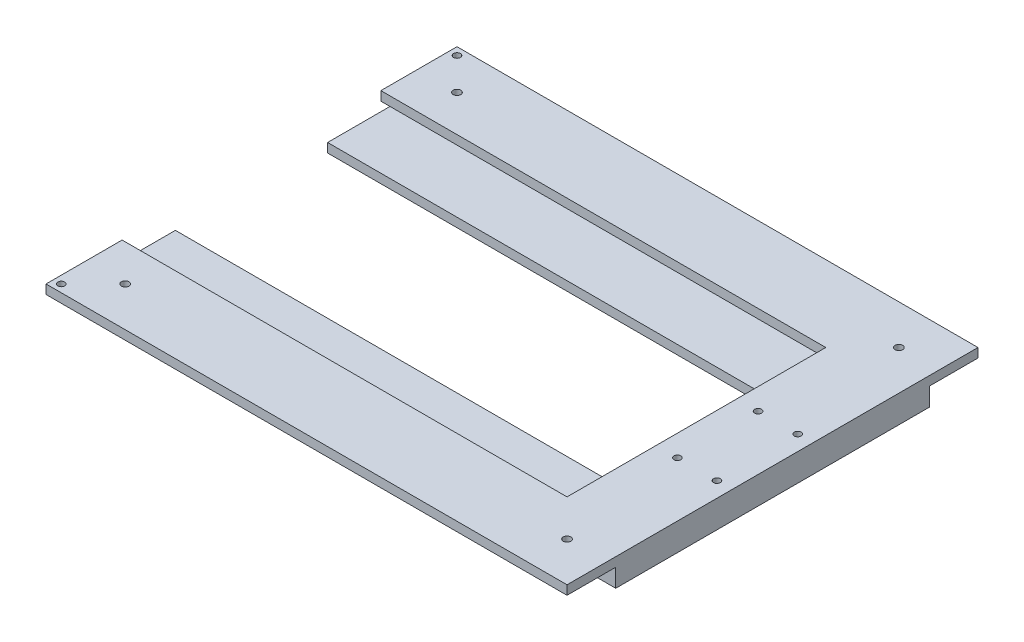
ISO-10303-21;
HEADER;
FILE_DESCRIPTION(('STEP AP214'),'2;1');
FILE_NAME('part.step','',(''),(''),'','','');
FILE_SCHEMA(('AUTOMOTIVE_DESIGN { 1 0 10303 214 1 1 1 1 }'));
ENDSEC;
DATA;
#1=APPLICATION_CONTEXT('core data for automotive mechanical design processes');
#2=APPLICATION_PROTOCOL_DEFINITION('international standard','automotive_design',2000,#1);
#3=PRODUCT_CONTEXT('',#1,'mechanical');
#4=PRODUCT('Part','Part','',(#3));
#5=PRODUCT_RELATED_PRODUCT_CATEGORY('part','',(#4));
#6=PRODUCT_DEFINITION_FORMATION('','',#4);
#7=PRODUCT_DEFINITION_CONTEXT('part definition',#1,'design');
#8=PRODUCT_DEFINITION('design','',#6,#7);
#9=PRODUCT_DEFINITION_SHAPE('','',#8);
#10=(LENGTH_UNIT() NAMED_UNIT(*) SI_UNIT(.MILLI.,.METRE.));
#11=(NAMED_UNIT(*) PLANE_ANGLE_UNIT() SI_UNIT($,.RADIAN.));
#12=(NAMED_UNIT(*) SI_UNIT($,.STERADIAN.) SOLID_ANGLE_UNIT());
#13=UNCERTAINTY_MEASURE_WITH_UNIT(LENGTH_MEASURE(1.E-05),#10,'distance_accuracy_value','');
#14=(GEOMETRIC_REPRESENTATION_CONTEXT(3) GLOBAL_UNCERTAINTY_ASSIGNED_CONTEXT((#13)) GLOBAL_UNIT_ASSIGNED_CONTEXT((#10,
#11,#12)) REPRESENTATION_CONTEXT('',''));
#15=CARTESIAN_POINT('',(0.,0.,0.));
#16=DIRECTION('',(0.,0.,1.));
#17=DIRECTION('',(1.,0.,0.));
#18=AXIS2_PLACEMENT_3D('',#15,#16,#17);
#19=CARTESIAN_POINT('',(0.,0.,0.));
#20=DIRECTION('',(0.,1.,0.));
#21=DIRECTION('',(0.,0.,1.));
#22=AXIS2_PLACEMENT_3D('',#19,#20,#21);
#23=PLANE('',#22);
#24=CARTESIAN_POINT('',(-287.3,0.,342.921508101416));
#25=DIRECTION('',(0.,-1.,0.));
#26=DIRECTION('',(0.,0.,-1.));
#27=AXIS2_PLACEMENT_3D('',#24,#25,#26);
#28=CIRCLE('',#27,2.24999999999996);
#29=CARTESIAN_POINT('',(-287.3,0.,340.671508101416));
#30=VERTEX_POINT('',#29);
#31=EDGE_CURVE('E583',#30,#30,#28,.T.);
#32=ORIENTED_EDGE('',*,*,#31,.F.);
#33=EDGE_LOOP('',(#32));
#34=FACE_BOUND('',#33,.T.);
#35=CARTESIAN_POINT('',(-266.3,0.,321.921508101416));
#36=DIRECTION('',(0.,1.,0.));
#37=DIRECTION('',(0.,0.,1.));
#38=AXIS2_PLACEMENT_3D('',#35,#36,#37);
#39=CIRCLE('',#38,2.49999999999991);
#40=CARTESIAN_POINT('',(-266.3,0.,324.421508101416));
#41=VERTEX_POINT('',#40);
#42=EDGE_CURVE('E288',#41,#41,#39,.T.);
#43=ORIENTED_EDGE('',*,*,#42,.T.);
#44=EDGE_LOOP('',(#43));
#45=FACE_BOUND('',#44,.T.);
#46=CARTESIAN_POINT('',(23.9999999999999,0.,321.921508101416));
#47=DIRECTION('',(0.,1.,0.));
#48=DIRECTION('',(0.,0.,1.));
#49=AXIS2_PLACEMENT_3D('',#46,#47,#48);
#50=CIRCLE('',#49,2.49999999999991);
#51=CARTESIAN_POINT('',(23.9999999999999,0.,324.421508101416));
#52=VERTEX_POINT('',#51);
#53=EDGE_CURVE('E277',#52,#52,#50,.T.);
#54=ORIENTED_EDGE('',*,*,#53,.T.);
#55=EDGE_LOOP('',(#54));
#56=FACE_BOUND('',#55,.T.);
#57=DIRECTION('',(-1.,0.,0.));
#58=VECTOR('',#57,1.);
#59=CARTESIAN_POINT('',(49.9999999999999,0.,315.921508101416));
#60=LINE('',#59,#58);
#61=CARTESIAN_POINT('',(49.9999999999999,0.,315.921508101416));
#62=VERTEX_POINT('',#61);
#63=CARTESIAN_POINT('',(-292.3,0.,315.921508101416));
#64=VERTEX_POINT('',#63);
#65=EDGE_CURVE('E300',#62,#64,#60,.T.);
#66=ORIENTED_EDGE('',*,*,#65,.F.);
#67=DIRECTION('',(0.,0.,-1.));
#68=VECTOR('',#67,1.);
#69=CARTESIAN_POINT('',(49.9999999999999,0.,77.9215081014159));
#70=LINE('',#69,#68);
#71=CARTESIAN_POINT('',(49.9999999999999,0.,347.921508101416));
#72=VERTEX_POINT('',#71);
#73=EDGE_CURVE('E409',#72,#62,#70,.T.);
#74=ORIENTED_EDGE('',*,*,#73,.F.);
#75=DIRECTION('',(1.,0.,0.));
#76=VECTOR('',#75,1.);
#77=CARTESIAN_POINT('',(-292.3,0.,347.921508101416));
#78=LINE('',#77,#76);
#79=CARTESIAN_POINT('',(-292.3,0.,347.921508101416));
#80=VERTEX_POINT('',#79);
#81=EDGE_CURVE('E405',#80,#72,#78,.T.);
#82=ORIENTED_EDGE('',*,*,#81,.F.);
#83=DIRECTION('',(0.,0.,1.));
#84=VECTOR('',#83,1.);
#85=CARTESIAN_POINT('',(-292.3,0.,297.921508101416));
#86=LINE('',#85,#84);
#87=EDGE_CURVE('E82',#64,#80,#86,.T.);
#88=ORIENTED_EDGE('',*,*,#87,.F.);
#89=EDGE_LOOP('',(#66,#74,#82,#88));
#90=FACE_BOUND('',#89,.T.);
#91=ADVANCED_FACE('F54',(#34,#45,#56,#90),#23,.F.);
#92=CARTESIAN_POINT('',(-287.3,0.,82.9215081014159));
#93=DIRECTION('',(0.,-1.,0.));
#94=DIRECTION('',(0.,0.,-1.));
#95=AXIS2_PLACEMENT_3D('',#92,#93,#94);
#96=CIRCLE('',#95,2.25000000000001);
#97=CARTESIAN_POINT('',(-287.3,0.,80.6715081014158));
#98=VERTEX_POINT('',#97);
#99=EDGE_CURVE('E579',#98,#98,#96,.T.);
#100=ORIENTED_EDGE('',*,*,#99,.F.);
#101=EDGE_LOOP('',(#100));
#102=FACE_BOUND('',#101,.T.);
#103=CARTESIAN_POINT('',(23.9999999999999,0.,103.921508101416));
#104=DIRECTION('',(0.,1.,0.));
#105=DIRECTION('',(0.,0.,1.));
#106=AXIS2_PLACEMENT_3D('',#103,#104,#105);
#107=CIRCLE('',#106,2.49999999999991);
#108=CARTESIAN_POINT('',(23.9999999999999,0.,106.421508101416));
#109=VERTEX_POINT('',#108);
#110=EDGE_CURVE('E284',#109,#109,#107,.T.);
#111=ORIENTED_EDGE('',*,*,#110,.T.);
#112=EDGE_LOOP('',(#111));
#113=FACE_BOUND('',#112,.T.);
#114=CARTESIAN_POINT('',(-266.3,0.,103.921508101416));
#115=DIRECTION('',(0.,1.,0.));
#116=DIRECTION('',(0.,0.,1.));
#117=AXIS2_PLACEMENT_3D('',#114,#115,#116);
#118=CIRCLE('',#117,2.49999999999991);
#119=CARTESIAN_POINT('',(-266.3,0.,106.421508101416));
#120=VERTEX_POINT('',#119);
#121=EDGE_CURVE('E296',#120,#120,#118,.T.);
#122=ORIENTED_EDGE('',*,*,#121,.T.);
#123=EDGE_LOOP('',(#122));
#124=FACE_BOUND('',#123,.T.);
#125=DIRECTION('',(1.,0.,0.));
#126=VECTOR('',#125,1.);
#127=CARTESIAN_POINT('',(49.9999999999999,0.,109.921508101416));
#128=LINE('',#127,#126);
#129=CARTESIAN_POINT('',(-292.3,0.,109.921508101416));
#130=VERTEX_POINT('',#129);
#131=CARTESIAN_POINT('',(49.9999999999999,0.,109.921508101416));
#132=VERTEX_POINT('',#131);
#133=EDGE_CURVE('E306',#130,#132,#128,.T.);
#134=ORIENTED_EDGE('',*,*,#133,.F.);
#135=DIRECTION('',(0.,0.,1.));
#136=VECTOR('',#135,1.);
#137=CARTESIAN_POINT('',(-292.3,0.,77.9215081014159));
#138=LINE('',#137,#136);
#139=CARTESIAN_POINT('',(-292.3,0.,77.9215081014159));
#140=VERTEX_POINT('',#139);
#141=EDGE_CURVE('E388',#140,#130,#138,.T.);
#142=ORIENTED_EDGE('',*,*,#141,.F.);
#143=DIRECTION('',(-1.,0.,0.));
#144=VECTOR('',#143,1.);
#145=CARTESIAN_POINT('',(-292.3,0.,77.9215081014159));
#146=LINE('',#145,#144);
#147=CARTESIAN_POINT('',(49.9999999999999,0.,77.9215081014159));
#148=VERTEX_POINT('',#147);
#149=EDGE_CURVE('E366',#148,#140,#146,.T.);
#150=ORIENTED_EDGE('',*,*,#149,.F.);
#151=EDGE_CURVE('E408',#132,#148,#70,.T.);
#152=ORIENTED_EDGE('',*,*,#151,.F.);
#153=EDGE_LOOP('',(#134,#142,#150,#152));
#154=FACE_BOUND('',#153,.T.);
#155=ADVANCED_FACE('F482',(#102,#113,#124,#154),#23,.F.);
#156=DIRECTION('',(-1.,0.,0.));
#157=VECTOR('',#156,1.);
#158=CARTESIAN_POINT('',(5.99999999999995,0.,121.921508101416));
#159=LINE('',#158,#157);
#160=CARTESIAN_POINT('',(5.99999999999995,0.,121.921508101416));
#161=VERTEX_POINT('',#160);
#162=CARTESIAN_POINT('',(-292.3,0.,121.921508101416));
#163=VERTEX_POINT('',#162);
#164=EDGE_CURVE('E73',#161,#163,#159,.T.);
#165=ORIENTED_EDGE('',*,*,#164,.F.);
#166=DIRECTION('',(0.,0.,-1.));
#167=VECTOR('',#166,1.);
#168=CARTESIAN_POINT('',(5.99999999999987,0.,303.921508101416));
#169=LINE('',#168,#167);
#170=CARTESIAN_POINT('',(5.99999999999987,0.,303.921508101416));
#171=VERTEX_POINT('',#170);
#172=EDGE_CURVE('E322',#171,#161,#169,.T.);
#173=ORIENTED_EDGE('',*,*,#172,.F.);
#174=DIRECTION('',(1.,0.,0.));
#175=VECTOR('',#174,1.);
#176=CARTESIAN_POINT('',(5.99999999999987,0.,303.921508101416));
#177=LINE('',#176,#175);
#178=CARTESIAN_POINT('',(-292.3,0.,303.921508101416));
#179=VERTEX_POINT('',#178);
#180=EDGE_CURVE('E318',#179,#171,#177,.T.);
#181=ORIENTED_EDGE('',*,*,#180,.F.);
#182=CARTESIAN_POINT('',(-292.3,0.,297.921508101416));
#183=VERTEX_POINT('',#182);
#184=EDGE_CURVE('E401',#183,#179,#86,.T.);
#185=ORIENTED_EDGE('',*,*,#184,.F.);
#186=DIRECTION('',(-1.,0.,0.));
#187=VECTOR('',#186,1.);
#188=CARTESIAN_POINT('',(-292.3,0.,297.921508101416));
#189=LINE('',#188,#187);
#190=CARTESIAN_POINT('',(-2.22044604925031E-13,0.,297.921508101416));
#191=VERTEX_POINT('',#190);
#192=EDGE_CURVE('E398',#191,#183,#189,.T.);
#193=ORIENTED_EDGE('',*,*,#192,.F.);
#194=DIRECTION('',(0.,0.,1.));
#195=VECTOR('',#194,1.);
#196=CARTESIAN_POINT('',(-2.22044604925031E-13,0.,127.921508101416));
#197=LINE('',#196,#195);
#198=CARTESIAN_POINT('',(-2.22044604925031E-13,0.,127.921508101416));
#199=VERTEX_POINT('',#198);
#200=EDGE_CURVE('E395',#199,#191,#197,.T.);
#201=ORIENTED_EDGE('',*,*,#200,.F.);
#202=DIRECTION('',(1.,0.,0.));
#203=VECTOR('',#202,1.);
#204=CARTESIAN_POINT('',(-292.3,0.,127.921508101416));
#205=LINE('',#204,#203);
#206=CARTESIAN_POINT('',(-292.3,0.,127.921508101416));
#207=VERTEX_POINT('',#206);
#208=EDGE_CURVE('E392',#207,#199,#205,.T.);
#209=ORIENTED_EDGE('',*,*,#208,.F.);
#210=EDGE_CURVE('E360',#163,#207,#138,.T.);
#211=ORIENTED_EDGE('',*,*,#210,.F.);
#212=EDGE_LOOP('',(#165,#173,#181,#185,#193,#201,#209,#211));
#213=FACE_BOUND('',#212,.T.);
#214=ADVANCED_FACE('F448',(#213),#23,.F.);
#215=CARTESIAN_POINT('',(-292.3,6.,77.9215081014159));
#216=DIRECTION('',(1.,0.,0.));
#217=DIRECTION('',(0.,0.,-1.));
#218=AXIS2_PLACEMENT_3D('',#215,#216,#217);
#219=PLANE('',#218);
#220=ORIENTED_EDGE('',*,*,#141,.T.);
#221=DIRECTION('',(0.,1.,0.));
#222=VECTOR('',#221,1.);
#223=CARTESIAN_POINT('',(-292.3,-6.,109.921508101416));
#224=LINE('',#223,#222);
#225=CARTESIAN_POINT('',(-292.3,-12.,109.921508101416));
#226=VERTEX_POINT('',#225);
#227=EDGE_CURVE('E337',#226,#130,#224,.T.);
#228=ORIENTED_EDGE('',*,*,#227,.F.);
#229=DIRECTION('',(0.,0.,-1.));
#230=VECTOR('',#229,1.);
#231=CARTESIAN_POINT('',(-292.3,-12.,162.921508101416));
#232=LINE('',#231,#230);
#233=CARTESIAN_POINT('',(-292.3,-12.,162.921508101416));
#234=VERTEX_POINT('',#233);
#235=EDGE_CURVE('E493',#234,#226,#232,.T.);
#236=ORIENTED_EDGE('',*,*,#235,.F.);
#237=DIRECTION('',(0.,1.,0.));
#238=VECTOR('',#237,1.);
#239=CARTESIAN_POINT('',(-292.3,-12.,162.921508101416));
#240=LINE('',#239,#238);
#241=CARTESIAN_POINT('',(-292.3,-6.,162.921508101416));
#242=VERTEX_POINT('',#241);
#243=EDGE_CURVE('E269',#234,#242,#240,.T.);
#244=ORIENTED_EDGE('',*,*,#243,.T.);
#245=DIRECTION('',(0.,0.,-1.));
#246=VECTOR('',#245,1.);
#247=CARTESIAN_POINT('',(-292.3,-6.,162.921508101416));
#248=LINE('',#247,#246);
#249=CARTESIAN_POINT('',(-292.3,-6.,121.921508101416));
#250=VERTEX_POINT('',#249);
#251=EDGE_CURVE('E516',#242,#250,#248,.T.);
#252=ORIENTED_EDGE('',*,*,#251,.T.);
#253=DIRECTION('',(0.,1.,0.));
#254=VECTOR('',#253,1.);
#255=CARTESIAN_POINT('',(-292.3,-6.,121.921508101416));
#256=LINE('',#255,#254);
#257=EDGE_CURVE('E341',#250,#163,#256,.T.);
#258=ORIENTED_EDGE('',*,*,#257,.T.);
#259=ORIENTED_EDGE('',*,*,#210,.T.);
#260=DIRECTION('',(0.,-1.,0.));
#261=VECTOR('',#260,1.);
#262=CARTESIAN_POINT('',(-292.3,6.,127.921508101416));
#263=LINE('',#262,#261);
#264=CARTESIAN_POINT('',(-292.3,6.,127.921508101416));
#265=VERTEX_POINT('',#264);
#266=EDGE_CURVE('E11',#265,#207,#263,.T.);
#267=ORIENTED_EDGE('',*,*,#266,.F.);
#268=DIRECTION('',(0.,0.,1.));
#269=VECTOR('',#268,1.);
#270=CARTESIAN_POINT('',(-292.3,6.,77.9215081014159));
#271=LINE('',#270,#269);
#272=CARTESIAN_POINT('',(-292.3,6.,77.9215081014159));
#273=VERTEX_POINT('',#272);
#274=EDGE_CURVE('E361',#273,#265,#271,.T.);
#275=ORIENTED_EDGE('',*,*,#274,.F.);
#276=DIRECTION('',(0.,-1.,0.));
#277=VECTOR('',#276,1.);
#278=CARTESIAN_POINT('',(-292.3,6.,77.9215081014159));
#279=LINE('',#278,#277);
#280=EDGE_CURVE('E387',#273,#140,#279,.T.);
#281=ORIENTED_EDGE('',*,*,#280,.T.);
#282=EDGE_LOOP('',(#220,#228,#236,#244,#252,#258,#259,#267,#275,#281));
#283=FACE_BOUND('',#282,.T.);
#284=ADVANCED_FACE('F57',(#283),#219,.F.);
#285=CARTESIAN_POINT('',(-292.3,6.,127.921508101416));
#286=DIRECTION('',(0.,0.,-1.));
#287=DIRECTION('',(-1.,0.,0.));
#288=AXIS2_PLACEMENT_3D('',#285,#286,#287);
#289=PLANE('',#288);
#290=ORIENTED_EDGE('',*,*,#208,.T.);
#291=DIRECTION('',(0.,-1.,0.));
#292=VECTOR('',#291,1.);
#293=CARTESIAN_POINT('',(-2.22044604925031E-13,6.,127.921508101416));
#294=LINE('',#293,#292);
#295=CARTESIAN_POINT('',(-2.22044604925031E-13,6.,127.921508101416));
#296=VERTEX_POINT('',#295);
#297=EDGE_CURVE('E64',#296,#199,#294,.T.);
#298=ORIENTED_EDGE('',*,*,#297,.F.);
#299=DIRECTION('',(1.,0.,0.));
#300=VECTOR('',#299,1.);
#301=CARTESIAN_POINT('',(-292.3,6.,127.921508101416));
#302=LINE('',#301,#300);
#303=EDGE_CURVE('E365',#265,#296,#302,.T.);
#304=ORIENTED_EDGE('',*,*,#303,.F.);
#305=ORIENTED_EDGE('',*,*,#266,.T.);
#306=EDGE_LOOP('',(#290,#298,#304,#305));
#307=FACE_BOUND('',#306,.T.);
#308=ADVANCED_FACE('F464',(#307),#289,.F.);
#309=CARTESIAN_POINT('',(-2.22044604925031E-13,6.,127.921508101416));
#310=DIRECTION('',(1.,0.,0.));
#311=DIRECTION('',(0.,0.,-1.));
#312=AXIS2_PLACEMENT_3D('',#309,#310,#311);
#313=PLANE('',#312);
#314=ORIENTED_EDGE('',*,*,#200,.T.);
#315=DIRECTION('',(0.,-1.,0.));
#316=VECTOR('',#315,1.);
#317=CARTESIAN_POINT('',(-2.22044604925031E-13,6.,297.921508101416));
#318=LINE('',#317,#316);
#319=CARTESIAN_POINT('',(-2.22044604925031E-13,6.,297.921508101416));
#320=VERTEX_POINT('',#319);
#321=EDGE_CURVE('E434',#320,#191,#318,.T.);
#322=ORIENTED_EDGE('',*,*,#321,.F.);
#323=DIRECTION('',(0.,0.,1.));
#324=VECTOR('',#323,1.);
#325=CARTESIAN_POINT('',(-2.22044604925031E-13,6.,127.921508101416));
#326=LINE('',#325,#324);
#327=EDGE_CURVE('E369',#296,#320,#326,.T.);
#328=ORIENTED_EDGE('',*,*,#327,.F.);
#329=ORIENTED_EDGE('',*,*,#297,.T.);
#330=EDGE_LOOP('',(#314,#322,#328,#329));
#331=FACE_BOUND('',#330,.T.);
#332=ADVANCED_FACE('F443',(#331),#313,.F.);
#333=CARTESIAN_POINT('',(-292.3,6.,297.921508101416));
#334=DIRECTION('',(0.,0.,1.));
#335=DIRECTION('',(1.,0.,0.));
#336=AXIS2_PLACEMENT_3D('',#333,#334,#335);
#337=PLANE('',#336);
#338=ORIENTED_EDGE('',*,*,#192,.T.);
#339=DIRECTION('',(0.,-1.,0.));
#340=VECTOR('',#339,1.);
#341=CARTESIAN_POINT('',(-292.3,6.,297.921508101416));
#342=LINE('',#341,#340);
#343=CARTESIAN_POINT('',(-292.3,6.,297.921508101416));
#344=VERTEX_POINT('',#343);
#345=EDGE_CURVE('E430',#344,#183,#342,.T.);
#346=ORIENTED_EDGE('',*,*,#345,.F.);
#347=DIRECTION('',(-1.,0.,0.));
#348=VECTOR('',#347,1.);
#349=CARTESIAN_POINT('',(-292.3,6.,297.921508101416));
#350=LINE('',#349,#348);
#351=EDGE_CURVE('E372',#320,#344,#350,.T.);
#352=ORIENTED_EDGE('',*,*,#351,.F.);
#353=ORIENTED_EDGE('',*,*,#321,.T.);
#354=EDGE_LOOP('',(#338,#346,#352,#353));
#355=FACE_BOUND('',#354,.T.);
#356=ADVANCED_FACE('F452',(#355),#337,.F.);
#357=CARTESIAN_POINT('',(-292.3,6.,297.921508101416));
#358=DIRECTION('',(1.,0.,0.));
#359=DIRECTION('',(0.,0.,-1.));
#360=AXIS2_PLACEMENT_3D('',#357,#358,#359);
#361=PLANE('',#360);
#362=ORIENTED_EDGE('',*,*,#184,.T.);
#363=DIRECTION('',(0.,1.,0.));
#364=VECTOR('',#363,1.);
#365=CARTESIAN_POINT('',(-292.3,-6.,303.921508101416));
#366=LINE('',#365,#364);
#367=CARTESIAN_POINT('',(-292.3,-6.,303.921508101416));
#368=VERTEX_POINT('',#367);
#369=EDGE_CURVE('E353',#368,#179,#366,.T.);
#370=ORIENTED_EDGE('',*,*,#369,.F.);
#371=DIRECTION('',(0.,0.,-1.));
#372=VECTOR('',#371,1.);
#373=CARTESIAN_POINT('',(-292.3,-6.,315.921508101416));
#374=LINE('',#373,#372);
#375=CARTESIAN_POINT('',(-292.3,-6.,262.921508101416));
#376=VERTEX_POINT('',#375);
#377=EDGE_CURVE('E256',#368,#376,#374,.T.);
#378=ORIENTED_EDGE('',*,*,#377,.T.);
#379=DIRECTION('',(0.,1.,0.));
#380=VECTOR('',#379,1.);
#381=CARTESIAN_POINT('',(-292.3,-12.,262.921508101416));
#382=LINE('',#381,#380);
#383=CARTESIAN_POINT('',(-292.3,-12.,262.921508101416));
#384=VERTEX_POINT('',#383);
#385=EDGE_CURVE('E506',#384,#376,#382,.T.);
#386=ORIENTED_EDGE('',*,*,#385,.F.);
#387=DIRECTION('',(0.,0.,-1.));
#388=VECTOR('',#387,1.);
#389=CARTESIAN_POINT('',(-292.3,-12.,315.921508101416));
#390=LINE('',#389,#388);
#391=CARTESIAN_POINT('',(-292.3,-12.,315.921508101416));
#392=VERTEX_POINT('',#391);
#393=EDGE_CURVE('E251',#392,#384,#390,.T.);
#394=ORIENTED_EDGE('',*,*,#393,.F.);
#395=DIRECTION('',(0.,1.,0.));
#396=VECTOR('',#395,1.);
#397=CARTESIAN_POINT('',(-292.3,-6.,315.921508101416));
#398=LINE('',#397,#396);
#399=EDGE_CURVE('E357',#392,#64,#398,.T.);
#400=ORIENTED_EDGE('',*,*,#399,.T.);
#401=ORIENTED_EDGE('',*,*,#87,.T.);
#402=DIRECTION('',(0.,-1.,0.));
#403=VECTOR('',#402,1.);
#404=CARTESIAN_POINT('',(-292.3,6.,347.921508101416));
#405=LINE('',#404,#403);
#406=CARTESIAN_POINT('',(-292.3,6.,347.921508101416));
#407=VERTEX_POINT('',#406);
#408=EDGE_CURVE('E426',#407,#80,#405,.T.);
#409=ORIENTED_EDGE('',*,*,#408,.F.);
#410=DIRECTION('',(0.,0.,1.));
#411=VECTOR('',#410,1.);
#412=CARTESIAN_POINT('',(-292.3,6.,297.921508101416));
#413=LINE('',#412,#411);
#414=EDGE_CURVE('E375',#344,#407,#413,.T.);
#415=ORIENTED_EDGE('',*,*,#414,.F.);
#416=ORIENTED_EDGE('',*,*,#345,.T.);
#417=EDGE_LOOP('',(#362,#370,#378,#386,#394,#400,#401,#409,#415,#416));
#418=FACE_BOUND('',#417,.T.);
#419=ADVANCED_FACE('F456',(#418),#361,.F.);
#420=CARTESIAN_POINT('',(-292.3,6.,347.921508101416));
#421=DIRECTION('',(0.,0.,-1.));
#422=DIRECTION('',(-1.,0.,0.));
#423=AXIS2_PLACEMENT_3D('',#420,#421,#422);
#424=PLANE('',#423);
#425=ORIENTED_EDGE('',*,*,#81,.T.);
#426=DIRECTION('',(0.,-1.,0.));
#427=VECTOR('',#426,1.);
#428=CARTESIAN_POINT('',(49.9999999999999,6.,347.921508101416));
#429=LINE('',#428,#427);
#430=CARTESIAN_POINT('',(49.9999999999999,6.,347.921508101416));
#431=VERTEX_POINT('',#430);
#432=EDGE_CURVE('E422',#431,#72,#429,.T.);
#433=ORIENTED_EDGE('',*,*,#432,.F.);
#434=DIRECTION('',(1.,0.,0.));
#435=VECTOR('',#434,1.);
#436=CARTESIAN_POINT('',(-292.3,6.,347.921508101416));
#437=LINE('',#436,#435);
#438=EDGE_CURVE('E378',#407,#431,#437,.T.);
#439=ORIENTED_EDGE('',*,*,#438,.F.);
#440=ORIENTED_EDGE('',*,*,#408,.T.);
#441=EDGE_LOOP('',(#425,#433,#439,#440));
#442=FACE_BOUND('',#441,.T.);
#443=ADVANCED_FACE('F611',(#442),#424,.F.);
#444=CARTESIAN_POINT('',(49.9999999999999,6.,77.9215081014159));
#445=DIRECTION('',(-1.,0.,0.));
#446=DIRECTION('',(0.,0.,1.));
#447=AXIS2_PLACEMENT_3D('',#444,#445,#446);
#448=PLANE('',#447);
#449=ORIENTED_EDGE('',*,*,#73,.T.);
#450=DIRECTION('',(0.,1.,0.));
#451=VECTOR('',#450,1.);
#452=CARTESIAN_POINT('',(49.9999999999999,-6.,315.921508101416));
#453=LINE('',#452,#451);
#454=CARTESIAN_POINT('',(49.9999999999999,-12.,315.921508101416));
#455=VERTEX_POINT('',#454);
#456=EDGE_CURVE('E314',#455,#62,#453,.T.);
#457=ORIENTED_EDGE('',*,*,#456,.F.);
#458=DIRECTION('',(0.,0.,1.));
#459=VECTOR('',#458,1.);
#460=CARTESIAN_POINT('',(49.9999999999999,-12.,109.921508101416));
#461=LINE('',#460,#459);
#462=CARTESIAN_POINT('',(49.9999999999999,-12.,109.921508101416));
#463=VERTEX_POINT('',#462);
#464=EDGE_CURVE('E492',#463,#455,#461,.T.);
#465=ORIENTED_EDGE('',*,*,#464,.F.);
#466=DIRECTION('',(0.,1.,0.));
#467=VECTOR('',#466,1.);
#468=CARTESIAN_POINT('',(49.9999999999999,-6.,109.921508101416));
#469=LINE('',#468,#467);
#470=EDGE_CURVE('E333',#463,#132,#469,.T.);
#471=ORIENTED_EDGE('',*,*,#470,.T.);
#472=ORIENTED_EDGE('',*,*,#151,.T.);
#473=DIRECTION('',(0.,-1.,0.));
#474=VECTOR('',#473,1.);
#475=CARTESIAN_POINT('',(49.9999999999999,6.,77.9215081014159));
#476=LINE('',#475,#474);
#477=CARTESIAN_POINT('',(49.9999999999999,6.,77.9215081014159));
#478=VERTEX_POINT('',#477);
#479=EDGE_CURVE('E418',#478,#148,#476,.T.);
#480=ORIENTED_EDGE('',*,*,#479,.F.);
#481=DIRECTION('',(0.,0.,-1.));
#482=VECTOR('',#481,1.);
#483=CARTESIAN_POINT('',(49.9999999999999,6.,77.9215081014159));
#484=LINE('',#483,#482);
#485=EDGE_CURVE('E381',#431,#478,#484,.T.);
#486=ORIENTED_EDGE('',*,*,#485,.F.);
#487=ORIENTED_EDGE('',*,*,#432,.T.);
#488=EDGE_LOOP('',(#449,#457,#465,#471,#472,#480,#486,#487));
#489=FACE_BOUND('',#488,.T.);
#490=ADVANCED_FACE('F472',(#489),#448,.F.);
#491=CARTESIAN_POINT('',(-292.3,6.,77.9215081014159));
#492=DIRECTION('',(0.,0.,1.));
#493=DIRECTION('',(1.,0.,0.));
#494=AXIS2_PLACEMENT_3D('',#491,#492,#493);
#495=PLANE('',#494);
#496=ORIENTED_EDGE('',*,*,#149,.T.);
#497=ORIENTED_EDGE('',*,*,#280,.F.);
#498=DIRECTION('',(-1.,0.,0.));
#499=VECTOR('',#498,1.);
#500=CARTESIAN_POINT('',(-292.3,6.,77.9215081014159));
#501=LINE('',#500,#499);
#502=EDGE_CURVE('E384',#478,#273,#501,.T.);
#503=ORIENTED_EDGE('',*,*,#502,.F.);
#504=ORIENTED_EDGE('',*,*,#479,.T.);
#505=EDGE_LOOP('',(#496,#497,#503,#504));
#506=FACE_BOUND('',#505,.T.);
#507=ADVANCED_FACE('F479',(#506),#495,.F.);
#508=CARTESIAN_POINT('',(0.,6.,0.));
#509=DIRECTION('',(0.,1.,0.));
#510=DIRECTION('',(0.,0.,1.));
#511=AXIS2_PLACEMENT_3D('',#508,#509,#510);
#512=PLANE('',#511);
#513=CARTESIAN_POINT('',(-287.3,6.,342.921508101416));
#514=DIRECTION('',(0.,-1.,0.));
#515=DIRECTION('',(0.,0.,-1.));
#516=AXIS2_PLACEMENT_3D('',#513,#514,#515);
#517=CIRCLE('',#516,2.24999999999996);
#518=CARTESIAN_POINT('',(-287.3,6.,340.671508101416));
#519=VERTEX_POINT('',#518);
#520=EDGE_CURVE('E556',#519,#519,#517,.T.);
#521=ORIENTED_EDGE('',*,*,#520,.T.);
#522=EDGE_LOOP('',(#521));
#523=FACE_BOUND('',#522,.T.);
#524=CARTESIAN_POINT('',(-287.3,6.,82.9215081014159));
#525=DIRECTION('',(0.,-1.,0.));
#526=DIRECTION('',(0.,0.,-1.));
#527=AXIS2_PLACEMENT_3D('',#524,#525,#526);
#528=CIRCLE('',#527,2.25000000000001);
#529=CARTESIAN_POINT('',(-287.3,6.,80.6715081014158));
#530=VERTEX_POINT('',#529);
#531=EDGE_CURVE('E575',#530,#530,#528,.T.);
#532=ORIENTED_EDGE('',*,*,#531,.T.);
#533=EDGE_LOOP('',(#532));
#534=FACE_BOUND('',#533,.T.);
#535=CARTESIAN_POINT('',(13.9999999999999,6.,239.421508101416));
#536=DIRECTION('',(0.,-1.,0.));
#537=DIRECTION('',(0.,0.,-1.));
#538=AXIS2_PLACEMENT_3D('',#535,#536,#537);
#539=CIRCLE('',#538,2.25);
#540=CARTESIAN_POINT('',(13.9999999999999,6.,237.171508101416));
#541=VERTEX_POINT('',#540);
#542=EDGE_CURVE('E551',#541,#541,#539,.T.);
#543=ORIENTED_EDGE('',*,*,#542,.T.);
#544=EDGE_LOOP('',(#543));
#545=FACE_BOUND('',#544,.T.);
#546=CARTESIAN_POINT('',(13.9999999999999,6.,186.421508101416));
#547=DIRECTION('',(0.,-1.,0.));
#548=DIRECTION('',(0.,0.,-1.));
#549=AXIS2_PLACEMENT_3D('',#546,#547,#548);
#550=CIRCLE('',#549,2.25);
#551=CARTESIAN_POINT('',(13.9999999999999,6.,184.171508101416));
#552=VERTEX_POINT('',#551);
#553=EDGE_CURVE('E560',#552,#552,#550,.T.);
#554=ORIENTED_EDGE('',*,*,#553,.T.);
#555=EDGE_LOOP('',(#554));
#556=FACE_BOUND('',#555,.T.);
#557=CARTESIAN_POINT('',(39.9999999999999,6.,186.421508101416));
#558=DIRECTION('',(0.,-1.,0.));
#559=DIRECTION('',(0.,0.,-1.));
#560=AXIS2_PLACEMENT_3D('',#557,#558,#559);
#561=CIRCLE('',#560,2.25);
#562=CARTESIAN_POINT('',(39.9999999999999,6.,184.171508101416));
#563=VERTEX_POINT('',#562);
#564=EDGE_CURVE('E568',#563,#563,#561,.T.);
#565=ORIENTED_EDGE('',*,*,#564,.T.);
#566=EDGE_LOOP('',(#565));
#567=FACE_BOUND('',#566,.T.);
#568=CARTESIAN_POINT('',(39.9999999999999,6.,239.421508101416));
#569=DIRECTION('',(0.,-1.,0.));
#570=DIRECTION('',(0.,0.,-1.));
#571=AXIS2_PLACEMENT_3D('',#568,#569,#570);
#572=CIRCLE('',#571,2.25);
#573=CARTESIAN_POINT('',(39.9999999999999,6.,237.171508101416));
#574=VERTEX_POINT('',#573);
#575=EDGE_CURVE('E510',#574,#574,#572,.T.);
#576=ORIENTED_EDGE('',*,*,#575,.T.);
#577=EDGE_LOOP('',(#576));
#578=FACE_BOUND('',#577,.T.);
#579=CARTESIAN_POINT('',(-266.3,6.,321.921508101416));
#580=DIRECTION('',(0.,1.,0.));
#581=DIRECTION('',(0.,0.,1.));
#582=AXIS2_PLACEMENT_3D('',#579,#580,#581);
#583=CIRCLE('',#582,2.49999999999991);
#584=CARTESIAN_POINT('',(-266.3,6.,324.421508101416));
#585=VERTEX_POINT('',#584);
#586=EDGE_CURVE('E273',#585,#585,#583,.T.);
#587=ORIENTED_EDGE('',*,*,#586,.F.);
#588=EDGE_LOOP('',(#587));
#589=FACE_BOUND('',#588,.T.);
#590=CARTESIAN_POINT('',(23.9999999999999,6.,103.921508101416));
#591=DIRECTION('',(0.,1.,0.));
#592=DIRECTION('',(0.,0.,1.));
#593=AXIS2_PLACEMENT_3D('',#590,#591,#592);
#594=CIRCLE('',#593,2.49999999999991);
#595=CARTESIAN_POINT('',(23.9999999999999,6.,106.421508101416));
#596=VERTEX_POINT('',#595);
#597=EDGE_CURVE('E267',#596,#596,#594,.T.);
#598=ORIENTED_EDGE('',*,*,#597,.F.);
#599=EDGE_LOOP('',(#598));
#600=FACE_BOUND('',#599,.T.);
#601=CARTESIAN_POINT('',(23.9999999999999,6.,321.921508101416));
#602=DIRECTION('',(0.,1.,0.));
#603=DIRECTION('',(0.,0.,1.));
#604=AXIS2_PLACEMENT_3D('',#601,#602,#603);
#605=CIRCLE('',#604,2.49999999999991);
#606=CARTESIAN_POINT('',(23.9999999999999,6.,324.421508101416));
#607=VERTEX_POINT('',#606);
#608=EDGE_CURVE('E262',#607,#607,#605,.T.);
#609=ORIENTED_EDGE('',*,*,#608,.F.);
#610=EDGE_LOOP('',(#609));
#611=FACE_BOUND('',#610,.T.);
#612=CARTESIAN_POINT('',(-266.3,6.,103.921508101416));
#613=DIRECTION('',(0.,1.,0.));
#614=DIRECTION('',(0.,0.,1.));
#615=AXIS2_PLACEMENT_3D('',#612,#613,#614);
#616=CIRCLE('',#615,2.49999999999991);
#617=CARTESIAN_POINT('',(-266.3,6.,106.421508101416));
#618=VERTEX_POINT('',#617);
#619=EDGE_CURVE('E292',#618,#618,#616,.T.);
#620=ORIENTED_EDGE('',*,*,#619,.F.);
#621=EDGE_LOOP('',(#620));
#622=FACE_BOUND('',#621,.T.);
#623=ORIENTED_EDGE('',*,*,#274,.T.);
#624=ORIENTED_EDGE('',*,*,#303,.T.);
#625=ORIENTED_EDGE('',*,*,#327,.T.);
#626=ORIENTED_EDGE('',*,*,#351,.T.);
#627=ORIENTED_EDGE('',*,*,#414,.T.);
#628=ORIENTED_EDGE('',*,*,#438,.T.);
#629=ORIENTED_EDGE('',*,*,#485,.T.);
#630=ORIENTED_EDGE('',*,*,#502,.T.);
#631=EDGE_LOOP('',(#623,#624,#625,#626,#627,#628,#629,#630));
#632=FACE_BOUND('',#631,.T.);
#633=ADVANCED_FACE('F460',(#523,#534,#545,#556,#567,#578,#589,#600,#611,#622,#632),#512,.T.);
#634=CARTESIAN_POINT('',(49.9999999999999,-6.,315.921508101416));
#635=DIRECTION('',(0.,0.,-1.));
#636=DIRECTION('',(-1.,0.,0.));
#637=AXIS2_PLACEMENT_3D('',#634,#635,#636);
#638=PLANE('',#637);
#639=ORIENTED_EDGE('',*,*,#65,.T.);
#640=ORIENTED_EDGE('',*,*,#399,.F.);
#641=DIRECTION('',(-1.,0.,0.));
#642=VECTOR('',#641,1.);
#643=CARTESIAN_POINT('',(49.9999999999999,-12.,315.921508101416));
#644=LINE('',#643,#642);
#645=EDGE_CURVE('E497',#455,#392,#644,.T.);
#646=ORIENTED_EDGE('',*,*,#645,.F.);
#647=ORIENTED_EDGE('',*,*,#456,.T.);
#648=EDGE_LOOP('',(#639,#640,#646,#647));
#649=FACE_BOUND('',#648,.T.);
#650=ADVANCED_FACE('F609',(#649),#638,.F.);
#651=CARTESIAN_POINT('',(5.99999999999987,-6.,303.921508101416));
#652=DIRECTION('',(0.,0.,1.));
#653=DIRECTION('',(1.,0.,0.));
#654=AXIS2_PLACEMENT_3D('',#651,#652,#653);
#655=PLANE('',#654);
#656=ORIENTED_EDGE('',*,*,#180,.T.);
#657=DIRECTION('',(0.,1.,0.));
#658=VECTOR('',#657,1.);
#659=CARTESIAN_POINT('',(5.99999999999987,-6.,303.921508101416));
#660=LINE('',#659,#658);
#661=CARTESIAN_POINT('',(5.99999999999987,-6.,303.921508101416));
#662=VERTEX_POINT('',#661);
#663=EDGE_CURVE('E349',#662,#171,#660,.T.);
#664=ORIENTED_EDGE('',*,*,#663,.F.);
#665=DIRECTION('',(1.,0.,0.));
#666=VECTOR('',#665,1.);
#667=CARTESIAN_POINT('',(5.99999999999987,-6.,303.921508101416));
#668=LINE('',#667,#666);
#669=EDGE_CURVE('E301',#368,#662,#668,.T.);
#670=ORIENTED_EDGE('',*,*,#669,.F.);
#671=ORIENTED_EDGE('',*,*,#369,.T.);
#672=EDGE_LOOP('',(#656,#664,#670,#671));
#673=FACE_BOUND('',#672,.T.);
#674=ADVANCED_FACE('F538',(#673),#655,.F.);
#675=CARTESIAN_POINT('',(5.99999999999987,-6.,303.921508101416));
#676=DIRECTION('',(1.,0.,0.));
#677=DIRECTION('',(0.,0.,-1.));
#678=AXIS2_PLACEMENT_3D('',#675,#676,#677);
#679=PLANE('',#678);
#680=ORIENTED_EDGE('',*,*,#172,.T.);
#681=DIRECTION('',(0.,1.,0.));
#682=VECTOR('',#681,1.);
#683=CARTESIAN_POINT('',(5.99999999999995,-6.,121.921508101416));
#684=LINE('',#683,#682);
#685=CARTESIAN_POINT('',(5.99999999999995,-6.,121.921508101416));
#686=VERTEX_POINT('',#685);
#687=EDGE_CURVE('E345',#686,#161,#684,.T.);
#688=ORIENTED_EDGE('',*,*,#687,.F.);
#689=DIRECTION('',(0.,0.,-1.));
#690=VECTOR('',#689,1.);
#691=CARTESIAN_POINT('',(5.99999999999987,-6.,303.921508101416));
#692=LINE('',#691,#690);
#693=EDGE_CURVE('E305',#662,#686,#692,.T.);
#694=ORIENTED_EDGE('',*,*,#693,.F.);
#695=ORIENTED_EDGE('',*,*,#663,.T.);
#696=EDGE_LOOP('',(#680,#688,#694,#695));
#697=FACE_BOUND('',#696,.T.);
#698=ADVANCED_FACE('F536',(#697),#679,.F.);
#699=CARTESIAN_POINT('',(5.99999999999995,-6.,121.921508101416));
#700=DIRECTION('',(0.,0.,-1.));
#701=DIRECTION('',(-1.,0.,0.));
#702=AXIS2_PLACEMENT_3D('',#699,#700,#701);
#703=PLANE('',#702);
#704=ORIENTED_EDGE('',*,*,#164,.T.);
#705=ORIENTED_EDGE('',*,*,#257,.F.);
#706=DIRECTION('',(-1.,0.,0.));
#707=VECTOR('',#706,1.);
#708=CARTESIAN_POINT('',(5.99999999999995,-6.,121.921508101416));
#709=LINE('',#708,#707);
#710=EDGE_CURVE('E310',#686,#250,#709,.T.);
#711=ORIENTED_EDGE('',*,*,#710,.F.);
#712=ORIENTED_EDGE('',*,*,#687,.T.);
#713=EDGE_LOOP('',(#704,#705,#711,#712));
#714=FACE_BOUND('',#713,.T.);
#715=ADVANCED_FACE('F534',(#714),#703,.F.);
#716=CARTESIAN_POINT('',(49.9999999999999,-6.,109.921508101416));
#717=DIRECTION('',(0.,0.,1.));
#718=DIRECTION('',(1.,0.,0.));
#719=AXIS2_PLACEMENT_3D('',#716,#717,#718);
#720=PLANE('',#719);
#721=ORIENTED_EDGE('',*,*,#133,.T.);
#722=ORIENTED_EDGE('',*,*,#470,.F.);
#723=DIRECTION('',(1.,0.,0.));
#724=VECTOR('',#723,1.);
#725=CARTESIAN_POINT('',(-292.3,-12.,109.921508101416));
#726=LINE('',#725,#724);
#727=EDGE_CURVE('E489',#226,#463,#726,.T.);
#728=ORIENTED_EDGE('',*,*,#727,.F.);
#729=ORIENTED_EDGE('',*,*,#227,.T.);
#730=EDGE_LOOP('',(#721,#722,#728,#729));
#731=FACE_BOUND('',#730,.T.);
#732=ADVANCED_FACE('F487',(#731),#720,.F.);
#733=CARTESIAN_POINT('',(-266.3,-6.,103.921508101416));
#734=DIRECTION('',(0.,1.,0.));
#735=DIRECTION('',(0.,0.,1.));
#736=AXIS2_PLACEMENT_3D('',#733,#734,#735);
#737=CYLINDRICAL_SURFACE('',#736,2.49999999999991);
#738=ORIENTED_EDGE('',*,*,#619,.T.);
#739=EDGE_LOOP('',(#738));
#740=FACE_BOUND('',#739,.T.);
#741=ORIENTED_EDGE('',*,*,#121,.F.);
#742=EDGE_LOOP('',(#741));
#743=FACE_BOUND('',#742,.T.);
#744=ADVANCED_FACE('F664',(#740,#743),#737,.F.);
#745=CARTESIAN_POINT('',(23.9999999999999,-6.,321.921508101416));
#746=DIRECTION('',(0.,1.,0.));
#747=DIRECTION('',(0.,0.,1.));
#748=AXIS2_PLACEMENT_3D('',#745,#746,#747);
#749=CYLINDRICAL_SURFACE('',#748,2.49999999999991);
#750=ORIENTED_EDGE('',*,*,#608,.T.);
#751=EDGE_LOOP('',(#750));
#752=FACE_BOUND('',#751,.T.);
#753=ORIENTED_EDGE('',*,*,#53,.F.);
#754=EDGE_LOOP('',(#753));
#755=FACE_BOUND('',#754,.T.);
#756=ADVANCED_FACE('F668',(#752,#755),#749,.F.);
#757=CARTESIAN_POINT('',(23.9999999999999,-6.,103.921508101416));
#758=DIRECTION('',(0.,1.,0.));
#759=DIRECTION('',(0.,0.,1.));
#760=AXIS2_PLACEMENT_3D('',#757,#758,#759);
#761=CYLINDRICAL_SURFACE('',#760,2.49999999999991);
#762=ORIENTED_EDGE('',*,*,#597,.T.);
#763=EDGE_LOOP('',(#762));
#764=FACE_BOUND('',#763,.T.);
#765=ORIENTED_EDGE('',*,*,#110,.F.);
#766=EDGE_LOOP('',(#765));
#767=FACE_BOUND('',#766,.T.);
#768=ADVANCED_FACE('F673',(#764,#767),#761,.F.);
#769=CARTESIAN_POINT('',(-266.3,-6.,321.921508101416));
#770=DIRECTION('',(0.,1.,0.));
#771=DIRECTION('',(0.,0.,1.));
#772=AXIS2_PLACEMENT_3D('',#769,#770,#771);
#773=CYLINDRICAL_SURFACE('',#772,2.49999999999991);
#774=ORIENTED_EDGE('',*,*,#586,.T.);
#775=EDGE_LOOP('',(#774));
#776=FACE_BOUND('',#775,.T.);
#777=ORIENTED_EDGE('',*,*,#42,.F.);
#778=EDGE_LOOP('',(#777));
#779=FACE_BOUND('',#778,.T.);
#780=ADVANCED_FACE('F678',(#776,#779),#773,.F.);
#781=CARTESIAN_POINT('',(-292.3,-12.,262.921508101416));
#782=DIRECTION('',(0.,0.,1.));
#783=DIRECTION('',(1.,0.,0.));
#784=AXIS2_PLACEMENT_3D('',#781,#782,#783);
#785=PLANE('',#784);
#786=DIRECTION('',(1.,0.,0.));
#787=VECTOR('',#786,1.);
#788=CARTESIAN_POINT('',(-292.3,-6.,262.921508101416));
#789=LINE('',#788,#787);
#790=CARTESIAN_POINT('',(-2.22044604925031E-13,-6.,262.921508101416));
#791=VERTEX_POINT('',#790);
#792=EDGE_CURVE('E260',#376,#791,#789,.T.);
#793=ORIENTED_EDGE('',*,*,#792,.T.);
#794=DIRECTION('',(0.,1.,0.));
#795=VECTOR('',#794,1.);
#796=CARTESIAN_POINT('',(-2.22044604925031E-13,-12.,262.921508101416));
#797=LINE('',#796,#795);
#798=CARTESIAN_POINT('',(-2.22044604925031E-13,-12.,262.921508101416));
#799=VERTEX_POINT('',#798);
#800=EDGE_CURVE('E237',#799,#791,#797,.T.);
#801=ORIENTED_EDGE('',*,*,#800,.F.);
#802=DIRECTION('',(1.,0.,0.));
#803=VECTOR('',#802,1.);
#804=CARTESIAN_POINT('',(-292.3,-12.,262.921508101416));
#805=LINE('',#804,#803);
#806=EDGE_CURVE('E245',#384,#799,#805,.T.);
#807=ORIENTED_EDGE('',*,*,#806,.F.);
#808=ORIENTED_EDGE('',*,*,#385,.T.);
#809=EDGE_LOOP('',(#793,#801,#807,#808));
#810=FACE_BOUND('',#809,.T.);
#811=ADVANCED_FACE('F258',(#810),#785,.F.);
#812=CARTESIAN_POINT('',(-2.22044604925031E-13,-12.,262.921508101416));
#813=DIRECTION('',(1.,0.,0.));
#814=DIRECTION('',(0.,0.,-1.));
#815=AXIS2_PLACEMENT_3D('',#812,#813,#814);
#816=PLANE('',#815);
#817=DIRECTION('',(0.,0.,-1.));
#818=VECTOR('',#817,1.);
#819=CARTESIAN_POINT('',(-2.22044604925031E-13,-6.,262.921508101416));
#820=LINE('',#819,#818);
#821=CARTESIAN_POINT('',(-2.22044604925031E-13,-6.,162.921508101416));
#822=VERTEX_POINT('',#821);
#823=EDGE_CURVE('E509',#791,#822,#820,.T.);
#824=ORIENTED_EDGE('',*,*,#823,.T.);
#825=DIRECTION('',(0.,1.,0.));
#826=VECTOR('',#825,1.);
#827=CARTESIAN_POINT('',(-2.22044604925031E-13,-12.,162.921508101416));
#828=LINE('',#827,#826);
#829=CARTESIAN_POINT('',(-2.22044604925031E-13,-12.,162.921508101416));
#830=VERTEX_POINT('',#829);
#831=EDGE_CURVE('E240',#830,#822,#828,.T.);
#832=ORIENTED_EDGE('',*,*,#831,.F.);
#833=DIRECTION('',(0.,0.,-1.));
#834=VECTOR('',#833,1.);
#835=CARTESIAN_POINT('',(-2.22044604925031E-13,-12.,262.921508101416));
#836=LINE('',#835,#834);
#837=EDGE_CURVE('E233',#799,#830,#836,.T.);
#838=ORIENTED_EDGE('',*,*,#837,.F.);
#839=ORIENTED_EDGE('',*,*,#800,.T.);
#840=EDGE_LOOP('',(#824,#832,#838,#839));
#841=FACE_BOUND('',#840,.T.);
#842=ADVANCED_FACE('F235',(#841),#816,.F.);
#843=CARTESIAN_POINT('',(-2.22044604925031E-13,-12.,162.921508101416));
#844=DIRECTION('',(0.,0.,-1.));
#845=DIRECTION('',(-1.,0.,0.));
#846=AXIS2_PLACEMENT_3D('',#843,#844,#845);
#847=PLANE('',#846);
#848=DIRECTION('',(-1.,0.,0.));
#849=VECTOR('',#848,1.);
#850=CARTESIAN_POINT('',(-2.22044604925031E-13,-6.,162.921508101416));
#851=LINE('',#850,#849);
#852=EDGE_CURVE('E513',#822,#242,#851,.T.);
#853=ORIENTED_EDGE('',*,*,#852,.T.);
#854=ORIENTED_EDGE('',*,*,#243,.F.);
#855=DIRECTION('',(-1.,0.,0.));
#856=VECTOR('',#855,1.);
#857=CARTESIAN_POINT('',(-2.22044604925031E-13,-12.,162.921508101416));
#858=LINE('',#857,#856);
#859=EDGE_CURVE('E244',#830,#234,#858,.T.);
#860=ORIENTED_EDGE('',*,*,#859,.F.);
#861=ORIENTED_EDGE('',*,*,#831,.T.);
#862=EDGE_LOOP('',(#853,#854,#860,#861));
#863=FACE_BOUND('',#862,.T.);
#864=ADVANCED_FACE('F540',(#863),#847,.F.);
#865=CARTESIAN_POINT('',(0.,-12.,0.));
#866=DIRECTION('',(0.,1.,0.));
#867=DIRECTION('',(0.,0.,1.));
#868=AXIS2_PLACEMENT_3D('',#865,#866,#867);
#869=PLANE('',#868);
#870=CARTESIAN_POINT('',(13.9999999999999,-12.,239.421508101416));
#871=DIRECTION('',(0.,-1.,0.));
#872=DIRECTION('',(0.,0.,-1.));
#873=AXIS2_PLACEMENT_3D('',#870,#871,#872);
#874=CIRCLE('',#873,2.25);
#875=CARTESIAN_POINT('',(13.9999999999999,-12.,237.171508101416));
#876=VERTEX_POINT('',#875);
#877=EDGE_CURVE('E555',#876,#876,#874,.T.);
#878=ORIENTED_EDGE('',*,*,#877,.F.);
#879=EDGE_LOOP('',(#878));
#880=FACE_BOUND('',#879,.T.);
#881=CARTESIAN_POINT('',(13.9999999999999,-12.,186.421508101416));
#882=DIRECTION('',(0.,-1.,0.));
#883=DIRECTION('',(0.,0.,-1.));
#884=AXIS2_PLACEMENT_3D('',#881,#882,#883);
#885=CIRCLE('',#884,2.25);
#886=CARTESIAN_POINT('',(13.9999999999999,-12.,184.171508101416));
#887=VERTEX_POINT('',#886);
#888=EDGE_CURVE('E564',#887,#887,#885,.T.);
#889=ORIENTED_EDGE('',*,*,#888,.F.);
#890=EDGE_LOOP('',(#889));
#891=FACE_BOUND('',#890,.T.);
#892=CARTESIAN_POINT('',(39.9999999999999,-12.,186.421508101416));
#893=DIRECTION('',(0.,-1.,0.));
#894=DIRECTION('',(0.,0.,-1.));
#895=AXIS2_PLACEMENT_3D('',#892,#893,#894);
#896=CIRCLE('',#895,2.25);
#897=CARTESIAN_POINT('',(39.9999999999999,-12.,184.171508101416));
#898=VERTEX_POINT('',#897);
#899=EDGE_CURVE('E547',#898,#898,#896,.T.);
#900=ORIENTED_EDGE('',*,*,#899,.F.);
#901=EDGE_LOOP('',(#900));
#902=FACE_BOUND('',#901,.T.);
#903=CARTESIAN_POINT('',(39.9999999999999,-12.,239.421508101416));
#904=DIRECTION('',(0.,-1.,0.));
#905=DIRECTION('',(0.,0.,-1.));
#906=AXIS2_PLACEMENT_3D('',#903,#904,#905);
#907=CIRCLE('',#906,2.25);
#908=CARTESIAN_POINT('',(39.9999999999999,-12.,237.171508101416));
#909=VERTEX_POINT('',#908);
#910=EDGE_CURVE('E543',#909,#909,#907,.T.);
#911=ORIENTED_EDGE('',*,*,#910,.F.);
#912=EDGE_LOOP('',(#911));
#913=FACE_BOUND('',#912,.T.);
#914=ORIENTED_EDGE('',*,*,#806,.T.);
#915=ORIENTED_EDGE('',*,*,#837,.T.);
#916=ORIENTED_EDGE('',*,*,#859,.T.);
#917=ORIENTED_EDGE('',*,*,#235,.T.);
#918=ORIENTED_EDGE('',*,*,#727,.T.);
#919=ORIENTED_EDGE('',*,*,#464,.T.);
#920=ORIENTED_EDGE('',*,*,#645,.T.);
#921=ORIENTED_EDGE('',*,*,#393,.T.);
#922=EDGE_LOOP('',(#914,#915,#916,#917,#918,#919,#920,#921));
#923=FACE_BOUND('',#922,.T.);
#924=ADVANCED_FACE('F248',(#880,#891,#902,#913,#923),#869,.F.);
#925=CARTESIAN_POINT('',(0.,-6.,0.));
#926=DIRECTION('',(0.,1.,0.));
#927=DIRECTION('',(0.,0.,1.));
#928=AXIS2_PLACEMENT_3D('',#925,#926,#927);
#929=PLANE('',#928);
#930=ORIENTED_EDGE('',*,*,#377,.F.);
#931=ORIENTED_EDGE('',*,*,#669,.T.);
#932=ORIENTED_EDGE('',*,*,#693,.T.);
#933=ORIENTED_EDGE('',*,*,#710,.T.);
#934=ORIENTED_EDGE('',*,*,#251,.F.);
#935=ORIENTED_EDGE('',*,*,#852,.F.);
#936=ORIENTED_EDGE('',*,*,#823,.F.);
#937=ORIENTED_EDGE('',*,*,#792,.F.);
#938=EDGE_LOOP('',(#930,#931,#932,#933,#934,#935,#936,#937));
#939=FACE_BOUND('',#938,.T.);
#940=ADVANCED_FACE('F530',(#939),#929,.T.);
#941=CARTESIAN_POINT('',(39.9999999999999,6.,239.421508101416));
#942=DIRECTION('',(0.,-1.,0.));
#943=DIRECTION('',(0.,0.,-1.));
#944=AXIS2_PLACEMENT_3D('',#941,#942,#943);
#945=CYLINDRICAL_SURFACE('',#944,2.25);
#946=ORIENTED_EDGE('',*,*,#575,.F.);
#947=EDGE_LOOP('',(#946));
#948=FACE_BOUND('',#947,.T.);
#949=ORIENTED_EDGE('',*,*,#910,.T.);
#950=EDGE_LOOP('',(#949));
#951=FACE_BOUND('',#950,.T.);
#952=ADVANCED_FACE('F697',(#948,#951),#945,.F.);
#953=CARTESIAN_POINT('',(39.9999999999999,6.,186.421508101416));
#954=DIRECTION('',(0.,-1.,0.));
#955=DIRECTION('',(0.,0.,-1.));
#956=AXIS2_PLACEMENT_3D('',#953,#954,#955);
#957=CYLINDRICAL_SURFACE('',#956,2.25);
#958=ORIENTED_EDGE('',*,*,#564,.F.);
#959=EDGE_LOOP('',(#958));
#960=FACE_BOUND('',#959,.T.);
#961=ORIENTED_EDGE('',*,*,#899,.T.);
#962=EDGE_LOOP('',(#961));
#963=FACE_BOUND('',#962,.T.);
#964=ADVANCED_FACE('F704',(#960,#963),#957,.F.);
#965=CARTESIAN_POINT('',(13.9999999999999,6.,186.421508101416));
#966=DIRECTION('',(0.,-1.,0.));
#967=DIRECTION('',(0.,0.,-1.));
#968=AXIS2_PLACEMENT_3D('',#965,#966,#967);
#969=CYLINDRICAL_SURFACE('',#968,2.25);
#970=ORIENTED_EDGE('',*,*,#553,.F.);
#971=EDGE_LOOP('',(#970));
#972=FACE_BOUND('',#971,.T.);
#973=ORIENTED_EDGE('',*,*,#888,.T.);
#974=EDGE_LOOP('',(#973));
#975=FACE_BOUND('',#974,.T.);
#976=ADVANCED_FACE('F712',(#972,#975),#969,.F.);
#977=CARTESIAN_POINT('',(13.9999999999999,6.,239.421508101416));
#978=DIRECTION('',(0.,-1.,0.));
#979=DIRECTION('',(0.,0.,-1.));
#980=AXIS2_PLACEMENT_3D('',#977,#978,#979);
#981=CYLINDRICAL_SURFACE('',#980,2.25);
#982=ORIENTED_EDGE('',*,*,#542,.F.);
#983=EDGE_LOOP('',(#982));
#984=FACE_BOUND('',#983,.T.);
#985=ORIENTED_EDGE('',*,*,#877,.T.);
#986=EDGE_LOOP('',(#985));
#987=FACE_BOUND('',#986,.T.);
#988=ADVANCED_FACE('F707',(#984,#987),#981,.F.);
#989=CARTESIAN_POINT('',(-287.3,6.,82.9215081014159));
#990=DIRECTION('',(0.,-1.,0.));
#991=DIRECTION('',(0.,0.,-1.));
#992=AXIS2_PLACEMENT_3D('',#989,#990,#991);
#993=CYLINDRICAL_SURFACE('',#992,2.25000000000001);
#994=ORIENTED_EDGE('',*,*,#531,.F.);
#995=EDGE_LOOP('',(#994));
#996=FACE_BOUND('',#995,.T.);
#997=ORIENTED_EDGE('',*,*,#99,.T.);
#998=EDGE_LOOP('',(#997));
#999=FACE_BOUND('',#998,.T.);
#1000=ADVANCED_FACE('F596',(#996,#999),#993,.F.);
#1001=CARTESIAN_POINT('',(-287.3,6.,342.921508101416));
#1002=DIRECTION('',(0.,-1.,0.));
#1003=DIRECTION('',(0.,0.,-1.));
#1004=AXIS2_PLACEMENT_3D('',#1001,#1002,#1003);
#1005=CYLINDRICAL_SURFACE('',#1004,2.24999999999996);
#1006=ORIENTED_EDGE('',*,*,#520,.F.);
#1007=EDGE_LOOP('',(#1006));
#1008=FACE_BOUND('',#1007,.T.);
#1009=ORIENTED_EDGE('',*,*,#31,.T.);
#1010=EDGE_LOOP('',(#1009));
#1011=FACE_BOUND('',#1010,.T.);
#1012=ADVANCED_FACE('F593',(#1008,#1011),#1005,.F.);
#1013=CLOSED_SHELL('',(#91,#155,#214,#284,#308,#332,#356,#419,#443,#490,#507,#633,#650,#674,
#698,#715,#732,#744,#756,#768,#780,#811,#842,#864,#924,#940,#952,#964,#976,#988,#1000,#1012));
#1014=MANIFOLD_SOLID_BREP('B2',#1013);
#1015=ADVANCED_BREP_SHAPE_REPRESENTATION('',(#18,#1014),#14);
#1016=SHAPE_DEFINITION_REPRESENTATION(#9,#1015);
ENDSEC;
END-ISO-10303-21;
